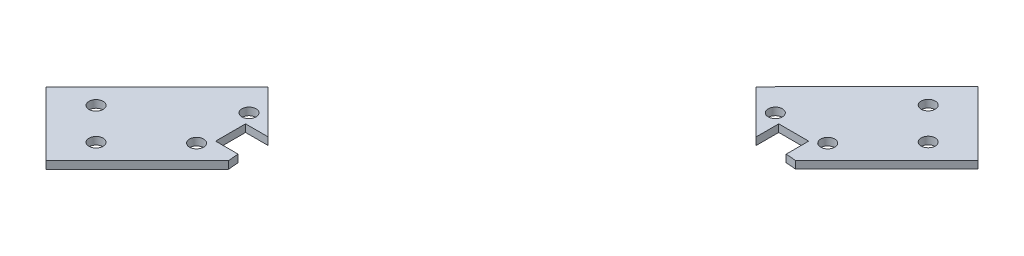
ISO-10303-21;
HEADER;
FILE_DESCRIPTION(('STEP AP214'),'2;1');
FILE_NAME('part.step','',(''),(''),'','','');
FILE_SCHEMA(('AUTOMOTIVE_DESIGN { 1 0 10303 214 1 1 1 1 }'));
ENDSEC;
DATA;
#1=APPLICATION_CONTEXT('core data for automotive mechanical design processes');
#2=APPLICATION_PROTOCOL_DEFINITION('international standard','automotive_design',2000,#1);
#3=PRODUCT_CONTEXT('',#1,'mechanical');
#4=PRODUCT('Part','Part','',(#3));
#5=PRODUCT_RELATED_PRODUCT_CATEGORY('part','',(#4));
#6=PRODUCT_DEFINITION_FORMATION('','',#4);
#7=PRODUCT_DEFINITION_CONTEXT('part definition',#1,'design');
#8=PRODUCT_DEFINITION('design','',#6,#7);
#9=PRODUCT_DEFINITION_SHAPE('','',#8);
#10=(LENGTH_UNIT() NAMED_UNIT(*) SI_UNIT(.MILLI.,.METRE.));
#11=(NAMED_UNIT(*) PLANE_ANGLE_UNIT() SI_UNIT($,.RADIAN.));
#12=(NAMED_UNIT(*) SI_UNIT($,.STERADIAN.) SOLID_ANGLE_UNIT());
#13=UNCERTAINTY_MEASURE_WITH_UNIT(LENGTH_MEASURE(1.E-05),#10,'distance_accuracy_value','');
#14=(GEOMETRIC_REPRESENTATION_CONTEXT(3) GLOBAL_UNCERTAINTY_ASSIGNED_CONTEXT((#13)) GLOBAL_UNIT_ASSIGNED_CONTEXT((#10,
#11,#12)) REPRESENTATION_CONTEXT('',''));
#15=CARTESIAN_POINT('',(0.,0.,0.));
#16=DIRECTION('',(0.,0.,1.));
#17=DIRECTION('',(1.,0.,0.));
#18=AXIS2_PLACEMENT_3D('',#15,#16,#17);
#19=CARTESIAN_POINT('',(0.,1.5875,0.));
#20=DIRECTION('',(0.,1.,0.));
#21=DIRECTION('',(0.,0.,1.));
#22=AXIS2_PLACEMENT_3D('',#19,#20,#21);
#23=PLANE('',#22);
#24=CARTESIAN_POINT('',(-72.1592637490422,1.5875,16.043664022809));
#25=DIRECTION('',(0.,1.,0.));
#26=DIRECTION('',(0.,0.,1.));
#27=AXIS2_PLACEMENT_3D('',#24,#25,#26);
#28=CIRCLE('',#27,1.5);
#29=CARTESIAN_POINT('',(-72.1592637490422,1.5875,17.543664022809));
#30=VERTEX_POINT('',#29);
#31=EDGE_CURVE('E194',#30,#30,#28,.T.);
#32=ORIENTED_EDGE('',*,*,#31,.F.);
#33=EDGE_LOOP('',(#32));
#34=FACE_BOUND('',#33,.T.);
#35=CARTESIAN_POINT('',(-78.9286379907904,1.5875,9.2807290260109));
#36=DIRECTION('',(0.,1.,0.));
#37=DIRECTION('',(0.,0.,1.));
#38=AXIS2_PLACEMENT_3D('',#35,#36,#37);
#39=CIRCLE('',#38,1.5);
#40=CARTESIAN_POINT('',(-78.9286379907904,1.5875,10.7807290260109));
#41=VERTEX_POINT('',#40);
#42=EDGE_CURVE('E230',#41,#41,#39,.T.);
#43=ORIENTED_EDGE('',*,*,#42,.F.);
#44=EDGE_LOOP('',(#43));
#45=FACE_BOUND('',#44,.T.);
#46=DIRECTION('',(0.706770229864482,0.,-0.707443172401365));
#47=VECTOR('',#46,1.);
#48=CARTESIAN_POINT('',(11.12169927642,1.5875,-87.6247258638486));
#49=LINE('',#48,#47);
#50=CARTESIAN_POINT('',(-87.6141018356481,1.5875,11.2050853206221));
#51=VERTEX_POINT('',#50);
#52=CARTESIAN_POINT('',(-64.0867150619098,1.5875,-12.3447027635743));
#53=VERTEX_POINT('',#52);
#54=EDGE_CURVE('E60',#51,#53,#49,.T.);
#55=ORIENTED_EDGE('',*,*,#54,.F.);
#56=DIRECTION('',(-0.707443172401365,0.,-0.706770229864482));
#57=VECTOR('',#56,1.);
#58=CARTESIAN_POINT('',(-49.3679005560341,1.5875,49.4149055922353));
#59=LINE('',#58,#57);
#60=CARTESIAN_POINT('',(-74.0753533521517,1.5875,24.7309553142183));
#61=VERTEX_POINT('',#60);
#62=EDGE_CURVE('E121',#61,#51,#59,.T.);
#63=ORIENTED_EDGE('',*,*,#62,.F.);
#64=DIRECTION('',(-0.706770229864482,0.,0.707443172401365));
#65=VECTOR('',#64,1.);
#66=CARTESIAN_POINT('',(-24.7074527961177,1.5875,-24.683950278017));
#67=LINE('',#66,#65);
#68=CARTESIAN_POINT('',(-54.7368246857531,1.5875,5.3740137068235));
#69=VERTEX_POINT('',#68);
#70=EDGE_CURVE('E170',#69,#61,#67,.T.);
#71=ORIENTED_EDGE('',*,*,#70,.F.);
#72=CARTESIAN_POINT('',(0.,1.5875,0.));
#73=DIRECTION('',(0.,1.,0.));
#74=DIRECTION('',(0.,0.,1.));
#75=AXIS2_PLACEMENT_3D('',#72,#73,#74);
#76=CIRCLE('',#75,55.);
#77=CARTESIAN_POINT('',(-54.9082814792085,1.5875,3.17500000000139));
#78=VERTEX_POINT('',#77);
#79=EDGE_CURVE('E143',#78,#69,#76,.T.);
#80=ORIENTED_EDGE('',*,*,#79,.F.);
#81=DIRECTION('',(1.,0.,0.));
#82=VECTOR('',#81,1.);
#83=CARTESIAN_POINT('',(-53.3400000000002,1.5875,3.17500000000139));
#84=LINE('',#83,#82);
#85=CARTESIAN_POINT('',(-59.6900000000002,1.5875,3.1750000000014));
#86=VERTEX_POINT('',#85);
#87=EDGE_CURVE('E157',#86,#78,#84,.T.);
#88=ORIENTED_EDGE('',*,*,#87,.F.);
#89=DIRECTION('',(0.,0.,1.));
#90=VECTOR('',#89,1.);
#91=CARTESIAN_POINT('',(-59.6900000000002,1.5875,-3.1749999999986));
#92=LINE('',#91,#90);
#93=CARTESIAN_POINT('',(-59.6900000000002,1.5875,-3.1749999999986));
#94=VERTEX_POINT('',#93);
#95=EDGE_CURVE('E155',#94,#86,#92,.T.);
#96=ORIENTED_EDGE('',*,*,#95,.F.);
#97=DIRECTION('',(-1.,0.,0.));
#98=VECTOR('',#97,1.);
#99=CARTESIAN_POINT('',(-53.3400000000002,1.5875,-3.17499999999861));
#100=LINE('',#99,#98);
#101=CARTESIAN_POINT('',(-54.9082814792087,1.5875,-3.17499999999861));
#102=VERTEX_POINT('',#101);
#103=EDGE_CURVE('E151',#102,#94,#100,.T.);
#104=ORIENTED_EDGE('',*,*,#103,.F.);
#105=DIRECTION('',(0.707443172401365,0.,0.706770229864482));
#106=VECTOR('',#105,1.);
#107=CARTESIAN_POINT('',(-54.9082814792087,1.5875,-3.17499999999861));
#108=LINE('',#107,#106);
#109=EDGE_CURVE('E53',#53,#102,#108,.T.);
#110=ORIENTED_EDGE('',*,*,#109,.F.);
#111=EDGE_LOOP('',(#55,#63,#71,#80,#88,#96,#104,#110));
#112=FACE_BOUND('',#111,.T.);
#113=CARTESIAN_POINT('',(-61.346730494,1.5875,-5.55625));
#114=DIRECTION('',(0.,1.,0.));
#115=DIRECTION('',(0.,0.,1.));
#116=AXIS2_PLACEMENT_3D('',#113,#114,#115);
#117=CIRCLE('',#116,1.5);
#118=CARTESIAN_POINT('',(-61.346730494,1.5875,-4.05625));
#119=VERTEX_POINT('',#118);
#120=EDGE_CURVE('E137',#119,#119,#117,.T.);
#121=ORIENTED_EDGE('',*,*,#120,.F.);
#122=EDGE_LOOP('',(#121));
#123=FACE_BOUND('',#122,.T.);
#124=CARTESIAN_POINT('',(-61.346730494,1.5875,5.55625));
#125=DIRECTION('',(0.,1.,0.));
#126=DIRECTION('',(0.,0.,1.));
#127=AXIS2_PLACEMENT_3D('',#124,#125,#126);
#128=CIRCLE('',#127,1.5);
#129=CARTESIAN_POINT('',(-61.346730494,1.5875,7.05625));
#130=VERTEX_POINT('',#129);
#131=EDGE_CURVE('E140',#130,#130,#128,.T.);
#132=ORIENTED_EDGE('',*,*,#131,.F.);
#133=EDGE_LOOP('',(#132));
#134=FACE_BOUND('',#133,.T.);
#135=ADVANCED_FACE('F46',(#34,#45,#112,#123,#134),#23,.T.);
#136=CARTESIAN_POINT('',(0.,0.,0.));
#137=DIRECTION('',(0.,1.,0.));
#138=DIRECTION('',(0.,0.,1.));
#139=AXIS2_PLACEMENT_3D('',#136,#137,#138);
#140=PLANE('',#139);
#141=CARTESIAN_POINT('',(-72.1592637490422,0.,16.043664022809));
#142=DIRECTION('',(0.,1.,0.));
#143=DIRECTION('',(0.,0.,1.));
#144=AXIS2_PLACEMENT_3D('',#141,#142,#143);
#145=CIRCLE('',#144,1.5);
#146=CARTESIAN_POINT('',(-72.1592637490422,0.,17.543664022809));
#147=VERTEX_POINT('',#146);
#148=EDGE_CURVE('E191',#147,#147,#145,.T.);
#149=ORIENTED_EDGE('',*,*,#148,.T.);
#150=EDGE_LOOP('',(#149));
#151=FACE_BOUND('',#150,.T.);
#152=CARTESIAN_POINT('',(-78.9286379907904,0.,9.2807290260109));
#153=DIRECTION('',(0.,1.,0.));
#154=DIRECTION('',(0.,0.,1.));
#155=AXIS2_PLACEMENT_3D('',#152,#153,#154);
#156=CIRCLE('',#155,1.5);
#157=CARTESIAN_POINT('',(-78.9286379907904,0.,10.7807290260109));
#158=VERTEX_POINT('',#157);
#159=EDGE_CURVE('E232',#158,#158,#156,.T.);
#160=ORIENTED_EDGE('',*,*,#159,.T.);
#161=EDGE_LOOP('',(#160));
#162=FACE_BOUND('',#161,.T.);
#163=CARTESIAN_POINT('',(-61.346730494,0.,-5.55625));
#164=DIRECTION('',(0.,1.,0.));
#165=DIRECTION('',(0.,0.,1.));
#166=AXIS2_PLACEMENT_3D('',#163,#164,#165);
#167=CIRCLE('',#166,1.5);
#168=CARTESIAN_POINT('',(-61.346730494,0.,-4.05625));
#169=VERTEX_POINT('',#168);
#170=EDGE_CURVE('E122',#169,#169,#167,.T.);
#171=ORIENTED_EDGE('',*,*,#170,.T.);
#172=EDGE_LOOP('',(#171));
#173=FACE_BOUND('',#172,.T.);
#174=CARTESIAN_POINT('',(-61.346730494,0.,5.55625));
#175=DIRECTION('',(0.,1.,0.));
#176=DIRECTION('',(0.,0.,1.));
#177=AXIS2_PLACEMENT_3D('',#174,#175,#176);
#178=CIRCLE('',#177,1.5);
#179=CARTESIAN_POINT('',(-61.346730494,0.,7.05625));
#180=VERTEX_POINT('',#179);
#181=EDGE_CURVE('E135',#180,#180,#178,.T.);
#182=ORIENTED_EDGE('',*,*,#181,.T.);
#183=EDGE_LOOP('',(#182));
#184=FACE_BOUND('',#183,.T.);
#185=DIRECTION('',(-0.707443172401365,0.,-0.706770229864482));
#186=VECTOR('',#185,1.);
#187=CARTESIAN_POINT('',(-49.3679005560341,0.,49.4149055922353));
#188=LINE('',#187,#186);
#189=CARTESIAN_POINT('',(-74.0753533521517,0.,24.7309553142183));
#190=VERTEX_POINT('',#189);
#191=CARTESIAN_POINT('',(-87.6141018356481,0.,11.2050853206221));
#192=VERTEX_POINT('',#191);
#193=EDGE_CURVE('E119',#190,#192,#188,.T.);
#194=ORIENTED_EDGE('',*,*,#193,.T.);
#195=DIRECTION('',(0.706770229864482,0.,-0.707443172401365));
#196=VECTOR('',#195,1.);
#197=CARTESIAN_POINT('',(11.12169927642,0.,-87.6247258638486));
#198=LINE('',#197,#196);
#199=CARTESIAN_POINT('',(-64.0867150619098,0.,-12.3447027635743));
#200=VERTEX_POINT('',#199);
#201=EDGE_CURVE('E108',#192,#200,#198,.T.);
#202=ORIENTED_EDGE('',*,*,#201,.T.);
#203=DIRECTION('',(0.707443172401365,0.,0.706770229864482));
#204=VECTOR('',#203,1.);
#205=CARTESIAN_POINT('',(-54.9082814792087,0.,-3.17499999999861));
#206=LINE('',#205,#204);
#207=CARTESIAN_POINT('',(-54.9082814792087,0.,-3.17499999999861));
#208=VERTEX_POINT('',#207);
#209=EDGE_CURVE('E67',#200,#208,#206,.T.);
#210=ORIENTED_EDGE('',*,*,#209,.T.);
#211=DIRECTION('',(-1.,0.,0.));
#212=VECTOR('',#211,1.);
#213=CARTESIAN_POINT('',(0.,0.,-3.17499999999861));
#214=LINE('',#213,#212);
#215=CARTESIAN_POINT('',(-59.6900000000002,0.,-3.1749999999986));
#216=VERTEX_POINT('',#215);
#217=EDGE_CURVE('E169',#208,#216,#214,.T.);
#218=ORIENTED_EDGE('',*,*,#217,.T.);
#219=DIRECTION('',(0.,0.,1.));
#220=VECTOR('',#219,1.);
#221=CARTESIAN_POINT('',(-59.6900000000002,0.,-3.1749999999986));
#222=LINE('',#221,#220);
#223=CARTESIAN_POINT('',(-59.6900000000002,0.,3.1750000000014));
#224=VERTEX_POINT('',#223);
#225=EDGE_CURVE('E166',#216,#224,#222,.T.);
#226=ORIENTED_EDGE('',*,*,#225,.T.);
#227=DIRECTION('',(1.,0.,0.));
#228=VECTOR('',#227,1.);
#229=CARTESIAN_POINT('',(-59.6900000000002,0.,3.1750000000014));
#230=LINE('',#229,#228);
#231=CARTESIAN_POINT('',(-54.9082814792085,0.,3.17500000000139));
#232=VERTEX_POINT('',#231);
#233=EDGE_CURVE('E163',#224,#232,#230,.T.);
#234=ORIENTED_EDGE('',*,*,#233,.T.);
#235=CARTESIAN_POINT('',(0.,0.,0.));
#236=DIRECTION('',(0.,1.,0.));
#237=DIRECTION('',(0.,0.,1.));
#238=AXIS2_PLACEMENT_3D('',#235,#236,#237);
#239=CIRCLE('',#238,55.);
#240=CARTESIAN_POINT('',(-54.7368246857531,0.,5.3740137068235));
#241=VERTEX_POINT('',#240);
#242=EDGE_CURVE('E131',#232,#241,#239,.T.);
#243=ORIENTED_EDGE('',*,*,#242,.T.);
#244=DIRECTION('',(-0.706770229864482,0.,0.707443172401365));
#245=VECTOR('',#244,1.);
#246=CARTESIAN_POINT('',(-24.7074527961177,0.,-24.683950278017));
#247=LINE('',#246,#245);
#248=EDGE_CURVE('E127',#241,#190,#247,.T.);
#249=ORIENTED_EDGE('',*,*,#248,.T.);
#250=EDGE_LOOP('',(#194,#202,#210,#218,#226,#234,#243,#249));
#251=FACE_BOUND('',#250,.T.);
#252=ADVANCED_FACE('F125',(#151,#162,#173,#184,#251),#140,.F.);
#253=CARTESIAN_POINT('',(-49.3679005560341,1.5875,49.4149055922353));
#254=DIRECTION('',(-0.706770229864482,0.,0.707443172401365));
#255=DIRECTION('',(0.707443172401365,0.,0.706770229864482));
#256=AXIS2_PLACEMENT_3D('',#253,#254,#255);
#257=PLANE('',#256);
#258=DIRECTION('',(0.,1.,0.));
#259=VECTOR('',#258,1.);
#260=CARTESIAN_POINT('',(-87.6141018356481,0.,11.2050853206221));
#261=LINE('',#260,#259);
#262=EDGE_CURVE('E111',#192,#51,#261,.T.);
#263=ORIENTED_EDGE('',*,*,#262,.F.);
#264=ORIENTED_EDGE('',*,*,#193,.F.);
#265=DIRECTION('',(0.,1.,0.));
#266=VECTOR('',#265,1.);
#267=CARTESIAN_POINT('',(-74.0753533521517,-8.4125,24.7309553142183));
#268=LINE('',#267,#266);
#269=EDGE_CURVE('E128',#190,#61,#268,.T.);
#270=ORIENTED_EDGE('',*,*,#269,.T.);
#271=ORIENTED_EDGE('',*,*,#62,.T.);
#272=EDGE_LOOP('',(#263,#264,#270,#271));
#273=FACE_BOUND('',#272,.T.);
#274=ADVANCED_FACE('F117',(#273),#257,.T.);
#275=CARTESIAN_POINT('',(-61.346730494,1.5875,-5.55625));
#276=DIRECTION('',(0.,-1.,0.));
#277=DIRECTION('',(0.,0.,-1.));
#278=AXIS2_PLACEMENT_3D('',#275,#276,#277);
#279=CYLINDRICAL_SURFACE('',#278,1.5);
#280=ORIENTED_EDGE('',*,*,#120,.T.);
#281=EDGE_LOOP('',(#280));
#282=FACE_BOUND('',#281,.T.);
#283=ORIENTED_EDGE('',*,*,#170,.F.);
#284=EDGE_LOOP('',(#283));
#285=FACE_BOUND('',#284,.T.);
#286=ADVANCED_FACE('F207',(#282,#285),#279,.F.);
#287=CARTESIAN_POINT('',(-61.346730494,1.5875,5.55625));
#288=DIRECTION('',(0.,-1.,0.));
#289=DIRECTION('',(0.,0.,-1.));
#290=AXIS2_PLACEMENT_3D('',#287,#288,#289);
#291=CYLINDRICAL_SURFACE('',#290,1.5);
#292=ORIENTED_EDGE('',*,*,#131,.T.);
#293=EDGE_LOOP('',(#292));
#294=FACE_BOUND('',#293,.T.);
#295=ORIENTED_EDGE('',*,*,#181,.F.);
#296=EDGE_LOOP('',(#295));
#297=FACE_BOUND('',#296,.T.);
#298=ADVANCED_FACE('F205',(#294,#297),#291,.F.);
#299=CARTESIAN_POINT('',(0.,1.5875,0.));
#300=DIRECTION('',(0.,-1.,0.));
#301=DIRECTION('',(0.,0.,-1.));
#302=AXIS2_PLACEMENT_3D('',#299,#300,#301);
#303=CYLINDRICAL_SURFACE('',#302,55.);
#304=DIRECTION('',(0.,1.,0.));
#305=VECTOR('',#304,1.);
#306=CARTESIAN_POINT('',(-54.7368246857531,-8.4125,5.3740137068235));
#307=LINE('',#306,#305);
#308=EDGE_CURVE('E162',#241,#69,#307,.T.);
#309=ORIENTED_EDGE('',*,*,#308,.F.);
#310=ORIENTED_EDGE('',*,*,#242,.F.);
#311=DIRECTION('',(0.,-1.,0.));
#312=VECTOR('',#311,1.);
#313=CARTESIAN_POINT('',(-54.9082814792085,1.5875,3.17500000000139));
#314=LINE('',#313,#312);
#315=EDGE_CURVE('E145',#78,#232,#314,.T.);
#316=ORIENTED_EDGE('',*,*,#315,.F.);
#317=ORIENTED_EDGE('',*,*,#79,.T.);
#318=EDGE_LOOP('',(#309,#310,#316,#317));
#319=FACE_BOUND('',#318,.T.);
#320=ADVANCED_FACE('F181',(#319),#303,.F.);
#321=CARTESIAN_POINT('',(-53.3400000000002,0.,3.17500000000139));
#322=DIRECTION('',(0.,0.,1.));
#323=DIRECTION('',(1.,0.,0.));
#324=AXIS2_PLACEMENT_3D('',#321,#322,#323);
#325=PLANE('',#324);
#326=ORIENTED_EDGE('',*,*,#315,.T.);
#327=ORIENTED_EDGE('',*,*,#233,.F.);
#328=DIRECTION('',(0.,1.,0.));
#329=VECTOR('',#328,1.);
#330=CARTESIAN_POINT('',(-59.6900000000002,0.,3.1750000000014));
#331=LINE('',#330,#329);
#332=EDGE_CURVE('E147',#224,#86,#331,.T.);
#333=ORIENTED_EDGE('',*,*,#332,.T.);
#334=ORIENTED_EDGE('',*,*,#87,.T.);
#335=EDGE_LOOP('',(#326,#327,#333,#334));
#336=FACE_BOUND('',#335,.T.);
#337=ADVANCED_FACE('F214',(#336),#325,.F.);
#338=CARTESIAN_POINT('',(-59.6900000000002,0.,-3.1749999999986));
#339=DIRECTION('',(-1.,0.,0.));
#340=DIRECTION('',(0.,0.,1.));
#341=AXIS2_PLACEMENT_3D('',#338,#339,#340);
#342=PLANE('',#341);
#343=ORIENTED_EDGE('',*,*,#95,.T.);
#344=ORIENTED_EDGE('',*,*,#332,.F.);
#345=ORIENTED_EDGE('',*,*,#225,.F.);
#346=DIRECTION('',(0.,1.,0.));
#347=VECTOR('',#346,1.);
#348=CARTESIAN_POINT('',(-59.6900000000002,0.,-3.1749999999986));
#349=LINE('',#348,#347);
#350=EDGE_CURVE('E152',#216,#94,#349,.T.);
#351=ORIENTED_EDGE('',*,*,#350,.T.);
#352=EDGE_LOOP('',(#343,#344,#345,#351));
#353=FACE_BOUND('',#352,.T.);
#354=ADVANCED_FACE('F281',(#353),#342,.F.);
#355=CARTESIAN_POINT('',(-53.3400000000002,0.,-3.17499999999861));
#356=DIRECTION('',(0.,0.,-1.));
#357=DIRECTION('',(-1.,0.,0.));
#358=AXIS2_PLACEMENT_3D('',#355,#356,#357);
#359=PLANE('',#358);
#360=DIRECTION('',(0.,-1.,0.));
#361=VECTOR('',#360,1.);
#362=CARTESIAN_POINT('',(-54.9082814792087,1.5875,-3.17499999999861));
#363=LINE('',#362,#361);
#364=EDGE_CURVE('E148',#208,#102,#363,.F.);
#365=ORIENTED_EDGE('',*,*,#364,.T.);
#366=ORIENTED_EDGE('',*,*,#103,.T.);
#367=ORIENTED_EDGE('',*,*,#350,.F.);
#368=ORIENTED_EDGE('',*,*,#217,.F.);
#369=EDGE_LOOP('',(#365,#366,#367,#368));
#370=FACE_BOUND('',#369,.T.);
#371=ADVANCED_FACE('F292',(#370),#359,.F.);
#372=CARTESIAN_POINT('',(-24.7074527961177,-8.4125,-24.683950278017));
#373=DIRECTION('',(-0.707443172401365,0.,-0.706770229864482));
#374=DIRECTION('',(-0.706770229864482,0.,0.707443172401365));
#375=AXIS2_PLACEMENT_3D('',#372,#373,#374);
#376=PLANE('',#375);
#377=ORIENTED_EDGE('',*,*,#308,.T.);
#378=ORIENTED_EDGE('',*,*,#70,.T.);
#379=ORIENTED_EDGE('',*,*,#269,.F.);
#380=ORIENTED_EDGE('',*,*,#248,.F.);
#381=EDGE_LOOP('',(#377,#378,#379,#380));
#382=FACE_BOUND('',#381,.T.);
#383=ADVANCED_FACE('F185',(#382),#376,.F.);
#384=CARTESIAN_POINT('',(-54.9082814792087,0.,-3.17499999999861));
#385=DIRECTION('',(-0.706770229864482,0.,0.707443172401365));
#386=DIRECTION('',(0.707443172401365,0.,0.706770229864482));
#387=AXIS2_PLACEMENT_3D('',#384,#385,#386);
#388=PLANE('',#387);
#389=ORIENTED_EDGE('',*,*,#209,.F.);
#390=DIRECTION('',(0.,1.,0.));
#391=VECTOR('',#390,1.);
#392=CARTESIAN_POINT('',(-64.0867150619098,0.,-12.3447027635743));
#393=LINE('',#392,#391);
#394=EDGE_CURVE('E12',#200,#53,#393,.T.);
#395=ORIENTED_EDGE('',*,*,#394,.T.);
#396=ORIENTED_EDGE('',*,*,#109,.T.);
#397=ORIENTED_EDGE('',*,*,#364,.F.);
#398=EDGE_LOOP('',(#389,#395,#396,#397));
#399=FACE_BOUND('',#398,.T.);
#400=ADVANCED_FACE('F250',(#399),#388,.F.);
#401=CARTESIAN_POINT('',(11.12169927642,0.,-87.6247258638486));
#402=DIRECTION('',(0.707443172401365,0.,0.706770229864482));
#403=DIRECTION('',(0.706770229864482,0.,-0.707443172401365));
#404=AXIS2_PLACEMENT_3D('',#401,#402,#403);
#405=PLANE('',#404);
#406=ORIENTED_EDGE('',*,*,#201,.F.);
#407=ORIENTED_EDGE('',*,*,#262,.T.);
#408=ORIENTED_EDGE('',*,*,#54,.T.);
#409=ORIENTED_EDGE('',*,*,#394,.F.);
#410=EDGE_LOOP('',(#406,#407,#408,#409));
#411=FACE_BOUND('',#410,.T.);
#412=ADVANCED_FACE('F110',(#411),#405,.F.);
#413=CARTESIAN_POINT('',(-78.9286379907904,0.,9.2807290260109));
#414=DIRECTION('',(0.,1.,0.));
#415=DIRECTION('',(0.,0.,1.));
#416=AXIS2_PLACEMENT_3D('',#413,#414,#415);
#417=CYLINDRICAL_SURFACE('',#416,1.5);
#418=ORIENTED_EDGE('',*,*,#159,.F.);
#419=EDGE_LOOP('',(#418));
#420=FACE_BOUND('',#419,.T.);
#421=ORIENTED_EDGE('',*,*,#42,.T.);
#422=EDGE_LOOP('',(#421));
#423=FACE_BOUND('',#422,.T.);
#424=ADVANCED_FACE('F239',(#420,#423),#417,.F.);
#425=CARTESIAN_POINT('',(-72.1592637490422,0.,16.043664022809));
#426=DIRECTION('',(0.,1.,0.));
#427=DIRECTION('',(0.,0.,1.));
#428=AXIS2_PLACEMENT_3D('',#425,#426,#427);
#429=CYLINDRICAL_SURFACE('',#428,1.5);
#430=ORIENTED_EDGE('',*,*,#148,.F.);
#431=EDGE_LOOP('',(#430));
#432=FACE_BOUND('',#431,.T.);
#433=ORIENTED_EDGE('',*,*,#31,.T.);
#434=EDGE_LOOP('',(#433));
#435=FACE_BOUND('',#434,.T.);
#436=ADVANCED_FACE('F237',(#432,#435),#429,.F.);
#437=CLOSED_SHELL('',(#135,#252,#274,#286,#298,#320,#337,#354,#371,#383,#400,#412,#424,#436));
#438=MANIFOLD_SOLID_BREP('B2',#437);
#439=CARTESIAN_POINT('',(5.55625,1.5875,-61.346730494));
#440=DIRECTION('',(0.,-1.,0.));
#441=DIRECTION('',(0.,0.,-1.));
#442=AXIS2_PLACEMENT_3D('',#439,#440,#441);
#443=CYLINDRICAL_SURFACE('',#442,1.5);
#444=CARTESIAN_POINT('',(5.55625,1.5875,-61.346730494));
#445=DIRECTION('',(0.,1.,0.));
#446=DIRECTION('',(0.,0.,1.));
#447=AXIS2_PLACEMENT_3D('',#444,#445,#446);
#448=CIRCLE('',#447,1.5);
#449=CARTESIAN_POINT('',(5.55625,1.5875,-59.846730494));
#450=VERTEX_POINT('',#449);
#451=EDGE_CURVE('E502',#450,#450,#448,.T.);
#452=ORIENTED_EDGE('',*,*,#451,.T.);
#453=EDGE_LOOP('',(#452));
#454=FACE_BOUND('',#453,.T.);
#455=CARTESIAN_POINT('',(5.55625,0.,-61.346730494));
#456=DIRECTION('',(0.,1.,0.));
#457=DIRECTION('',(0.,0.,1.));
#458=AXIS2_PLACEMENT_3D('',#455,#456,#457);
#459=CIRCLE('',#458,1.5);
#460=CARTESIAN_POINT('',(5.55625,0.,-59.846730494));
#461=VERTEX_POINT('',#460);
#462=EDGE_CURVE('E468',#461,#461,#459,.T.);
#463=ORIENTED_EDGE('',*,*,#462,.F.);
#464=EDGE_LOOP('',(#463));
#465=FACE_BOUND('',#464,.T.);
#466=ADVANCED_FACE('F381',(#454,#465),#443,.F.);
#467=CARTESIAN_POINT('',(-5.55625,1.5875,-61.346730494));
#468=DIRECTION('',(0.,-1.,0.));
#469=DIRECTION('',(0.,0.,-1.));
#470=AXIS2_PLACEMENT_3D('',#467,#468,#469);
#471=CYLINDRICAL_SURFACE('',#470,1.5);
#472=CARTESIAN_POINT('',(-5.55625,1.5875,-61.346730494));
#473=DIRECTION('',(0.,1.,0.));
#474=DIRECTION('',(0.,0.,1.));
#475=AXIS2_PLACEMENT_3D('',#472,#473,#474);
#476=CIRCLE('',#475,1.5);
#477=CARTESIAN_POINT('',(-5.55625,1.5875,-59.846730494));
#478=VERTEX_POINT('',#477);
#479=EDGE_CURVE('E500',#478,#478,#476,.T.);
#480=ORIENTED_EDGE('',*,*,#479,.T.);
#481=EDGE_LOOP('',(#480));
#482=FACE_BOUND('',#481,.T.);
#483=CARTESIAN_POINT('',(-5.55625,0.,-61.346730494));
#484=DIRECTION('',(0.,1.,0.));
#485=DIRECTION('',(0.,0.,1.));
#486=AXIS2_PLACEMENT_3D('',#483,#484,#485);
#487=CIRCLE('',#486,1.5);
#488=CARTESIAN_POINT('',(-5.55625,0.,-59.846730494));
#489=VERTEX_POINT('',#488);
#490=EDGE_CURVE('E464',#489,#489,#487,.T.);
#491=ORIENTED_EDGE('',*,*,#490,.F.);
#492=EDGE_LOOP('',(#491));
#493=FACE_BOUND('',#492,.T.);
#494=ADVANCED_FACE('F526',(#482,#493),#471,.F.);
#495=CARTESIAN_POINT('',(3.175,0.,-53.34));
#496=DIRECTION('',(1.,0.,0.));
#497=DIRECTION('',(0.,0.,-1.));
#498=AXIS2_PLACEMENT_3D('',#495,#496,#497);
#499=PLANE('',#498);
#500=DIRECTION('',(0.,-1.,0.));
#501=VECTOR('',#500,1.);
#502=CARTESIAN_POINT('',(3.175,1.5875,-54.9082814792086));
#503=LINE('',#502,#501);
#504=CARTESIAN_POINT('',(3.175,0.,-54.9082814792086));
#505=VERTEX_POINT('',#504);
#506=CARTESIAN_POINT('',(3.175,1.5875,-54.9082814792086));
#507=VERTEX_POINT('',#506);
#508=EDGE_CURVE('E471',#505,#507,#503,.F.);
#509=ORIENTED_EDGE('',*,*,#508,.T.);
#510=DIRECTION('',(0.,0.,-1.));
#511=VECTOR('',#510,1.);
#512=CARTESIAN_POINT('',(3.175,1.5875,-53.34));
#513=LINE('',#512,#511);
#514=CARTESIAN_POINT('',(3.175,1.5875,-59.69));
#515=VERTEX_POINT('',#514);
#516=EDGE_CURVE('E584',#507,#515,#513,.T.);
#517=ORIENTED_EDGE('',*,*,#516,.T.);
#518=DIRECTION('',(0.,1.,0.));
#519=VECTOR('',#518,1.);
#520=CARTESIAN_POINT('',(3.175,0.,-59.69));
#521=LINE('',#520,#519);
#522=CARTESIAN_POINT('',(3.175,0.,-59.69));
#523=VERTEX_POINT('',#522);
#524=EDGE_CURVE('E495',#523,#515,#521,.T.);
#525=ORIENTED_EDGE('',*,*,#524,.F.);
#526=DIRECTION('',(0.,0.,-1.));
#527=VECTOR('',#526,1.);
#528=CARTESIAN_POINT('',(3.175,0.,0.));
#529=LINE('',#528,#527);
#530=EDGE_CURVE('E482',#505,#523,#529,.T.);
#531=ORIENTED_EDGE('',*,*,#530,.F.);
#532=EDGE_LOOP('',(#509,#517,#525,#531));
#533=FACE_BOUND('',#532,.T.);
#534=ADVANCED_FACE('F531',(#533),#499,.F.);
#535=CARTESIAN_POINT('',(0.,1.5875,0.));
#536=DIRECTION('',(0.,-1.,0.));
#537=DIRECTION('',(0.,0.,-1.));
#538=AXIS2_PLACEMENT_3D('',#535,#536,#537);
#539=CYLINDRICAL_SURFACE('',#538,55.);
#540=DIRECTION('',(0.,1.,0.));
#541=VECTOR('',#540,1.);
#542=CARTESIAN_POINT('',(5.32191909351782,-8.4125,-54.7419142628576));
#543=LINE('',#542,#541);
#544=CARTESIAN_POINT('',(5.32191909351782,0.,-54.7419142628576));
#545=VERTEX_POINT('',#544);
#546=CARTESIAN_POINT('',(5.32191909351782,1.5875,-54.7419142628576));
#547=VERTEX_POINT('',#546);
#548=EDGE_CURVE('E403',#545,#547,#543,.T.);
#549=ORIENTED_EDGE('',*,*,#548,.T.);
#550=CARTESIAN_POINT('',(0.,1.5875,0.));
#551=DIRECTION('',(0.,1.,0.));
#552=DIRECTION('',(0.,0.,1.));
#553=AXIS2_PLACEMENT_3D('',#550,#551,#552);
#554=CIRCLE('',#553,55.);
#555=EDGE_CURVE('E474',#547,#507,#554,.T.);
#556=ORIENTED_EDGE('',*,*,#555,.T.);
#557=ORIENTED_EDGE('',*,*,#508,.F.);
#558=CARTESIAN_POINT('',(0.,0.,0.));
#559=DIRECTION('',(0.,1.,0.));
#560=DIRECTION('',(0.,0.,1.));
#561=AXIS2_PLACEMENT_3D('',#558,#559,#560);
#562=CIRCLE('',#561,55.);
#563=EDGE_CURVE('E479',#545,#505,#562,.T.);
#564=ORIENTED_EDGE('',*,*,#563,.F.);
#565=EDGE_LOOP('',(#549,#556,#557,#564));
#566=FACE_BOUND('',#565,.T.);
#567=ADVANCED_FACE('F488',(#566),#539,.F.);
#568=CARTESIAN_POINT('',(-24.7074527961177,-8.4125,-24.683950278017));
#569=DIRECTION('',(-0.707443172401365,0.,-0.706770229864482));
#570=DIRECTION('',(-0.706770229864482,0.,0.707443172401365));
#571=AXIS2_PLACEMENT_3D('',#568,#569,#570);
#572=PLANE('',#571);
#573=DIRECTION('',(0.,1.,0.));
#574=VECTOR('',#573,1.);
#575=CARTESIAN_POINT('',(24.6604477599164,-8.4125,-74.0988558702524));
#576=LINE('',#575,#574);
#577=CARTESIAN_POINT('',(24.6604477599164,0.,-74.0988558702524));
#578=VERTEX_POINT('',#577);
#579=CARTESIAN_POINT('',(24.6604477599164,1.5875,-74.0988558702524));
#580=VERTEX_POINT('',#579);
#581=EDGE_CURVE('E463',#578,#580,#576,.T.);
#582=ORIENTED_EDGE('',*,*,#581,.T.);
#583=DIRECTION('',(-0.706770229864482,0.,0.707443172401365));
#584=VECTOR('',#583,1.);
#585=CARTESIAN_POINT('',(-24.7074527961177,1.5875,-24.683950278017));
#586=LINE('',#585,#584);
#587=EDGE_CURVE('E579',#580,#547,#586,.T.);
#588=ORIENTED_EDGE('',*,*,#587,.T.);
#589=ORIENTED_EDGE('',*,*,#548,.F.);
#590=DIRECTION('',(-0.706770229864482,0.,0.707443172401365));
#591=VECTOR('',#590,1.);
#592=CARTESIAN_POINT('',(-24.7074527961177,0.,-24.683950278017));
#593=LINE('',#592,#591);
#594=EDGE_CURVE('E389',#578,#545,#593,.T.);
#595=ORIENTED_EDGE('',*,*,#594,.F.);
#596=EDGE_LOOP('',(#582,#588,#589,#595));
#597=FACE_BOUND('',#596,.T.);
#598=ADVANCED_FACE('F535',(#597),#572,.F.);
#599=CARTESIAN_POINT('',(49.3679005560341,1.5875,-49.4149055922353));
#600=DIRECTION('',(-0.706770229864482,0.,0.707443172401365));
#601=DIRECTION('',(0.707443172401365,0.,0.706770229864482));
#602=AXIS2_PLACEMENT_3D('',#599,#600,#601);
#603=PLANE('',#602);
#604=DIRECTION('',(-0.707443172401365,0.,-0.706770229864482));
#605=VECTOR('',#604,1.);
#606=CARTESIAN_POINT('',(49.3679005560341,0.,-49.4149055922353));
#607=LINE('',#606,#605);
#608=CARTESIAN_POINT('',(11.12169927642,0.,-87.6247258638486));
#609=VERTEX_POINT('',#608);
#610=EDGE_CURVE('E458',#578,#609,#607,.T.);
#611=ORIENTED_EDGE('',*,*,#610,.T.);
#612=DIRECTION('',(0.,1.,0.));
#613=VECTOR('',#612,1.);
#614=CARTESIAN_POINT('',(11.12169927642,0.,-87.6247258638486));
#615=LINE('',#614,#613);
#616=CARTESIAN_POINT('',(11.12169927642,1.5875,-87.6247258638486));
#617=VERTEX_POINT('',#616);
#618=EDGE_CURVE('E443',#609,#617,#615,.T.);
#619=ORIENTED_EDGE('',*,*,#618,.T.);
#620=DIRECTION('',(-0.707443172401365,0.,-0.706770229864482));
#621=VECTOR('',#620,1.);
#622=CARTESIAN_POINT('',(49.3679005560341,1.5875,-49.4149055922353));
#623=LINE('',#622,#621);
#624=EDGE_CURVE('E481',#580,#617,#623,.T.);
#625=ORIENTED_EDGE('',*,*,#624,.F.);
#626=ORIENTED_EDGE('',*,*,#581,.F.);
#627=EDGE_LOOP('',(#611,#619,#625,#626));
#628=FACE_BOUND('',#627,.T.);
#629=ADVANCED_FACE('F383',(#628),#603,.F.);
#630=CARTESIAN_POINT('',(3.175,0.,-59.69));
#631=DIRECTION('',(0.,0.,-1.));
#632=DIRECTION('',(-1.,0.,0.));
#633=AXIS2_PLACEMENT_3D('',#630,#631,#632);
#634=PLANE('',#633);
#635=DIRECTION('',(-1.,0.,0.));
#636=VECTOR('',#635,1.);
#637=CARTESIAN_POINT('',(3.175,1.5875,-59.69));
#638=LINE('',#637,#636);
#639=CARTESIAN_POINT('',(-3.175,1.5875,-59.69));
#640=VERTEX_POINT('',#639);
#641=EDGE_CURVE('E593',#515,#640,#638,.T.);
#642=ORIENTED_EDGE('',*,*,#641,.T.);
#643=DIRECTION('',(0.,1.,0.));
#644=VECTOR('',#643,1.);
#645=CARTESIAN_POINT('',(-3.175,0.,-59.69));
#646=LINE('',#645,#644);
#647=CARTESIAN_POINT('',(-3.175,0.,-59.69));
#648=VERTEX_POINT('',#647);
#649=EDGE_CURVE('E493',#648,#640,#646,.T.);
#650=ORIENTED_EDGE('',*,*,#649,.F.);
#651=DIRECTION('',(-1.,0.,0.));
#652=VECTOR('',#651,1.);
#653=CARTESIAN_POINT('',(3.175,0.,-59.69));
#654=LINE('',#653,#652);
#655=EDGE_CURVE('E586',#523,#648,#654,.T.);
#656=ORIENTED_EDGE('',*,*,#655,.F.);
#657=ORIENTED_EDGE('',*,*,#524,.T.);
#658=EDGE_LOOP('',(#642,#650,#656,#657));
#659=FACE_BOUND('',#658,.T.);
#660=ADVANCED_FACE('F544',(#659),#634,.F.);
#661=CARTESIAN_POINT('',(-3.175,0.,-53.34));
#662=DIRECTION('',(-1.,0.,0.));
#663=DIRECTION('',(0.,0.,1.));
#664=AXIS2_PLACEMENT_3D('',#661,#662,#663);
#665=PLANE('',#664);
#666=DIRECTION('',(0.,-1.,0.));
#667=VECTOR('',#666,1.);
#668=CARTESIAN_POINT('',(-3.175,1.5875,-54.9082814792086));
#669=LINE('',#668,#667);
#670=CARTESIAN_POINT('',(-3.175,1.5875,-54.9082814792086));
#671=VERTEX_POINT('',#670);
#672=CARTESIAN_POINT('',(-3.175,0.,-54.9082814792086));
#673=VERTEX_POINT('',#672);
#674=EDGE_CURVE('E465',#671,#673,#669,.T.);
#675=ORIENTED_EDGE('',*,*,#674,.T.);
#676=DIRECTION('',(0.,0.,1.));
#677=VECTOR('',#676,1.);
#678=CARTESIAN_POINT('',(-3.175,0.,-59.69));
#679=LINE('',#678,#677);
#680=EDGE_CURVE('E589',#648,#673,#679,.T.);
#681=ORIENTED_EDGE('',*,*,#680,.F.);
#682=ORIENTED_EDGE('',*,*,#649,.T.);
#683=DIRECTION('',(0.,0.,1.));
#684=VECTOR('',#683,1.);
#685=CARTESIAN_POINT('',(-3.175,1.5875,-53.34));
#686=LINE('',#685,#684);
#687=EDGE_CURVE('E590',#640,#671,#686,.T.);
#688=ORIENTED_EDGE('',*,*,#687,.T.);
#689=EDGE_LOOP('',(#675,#681,#682,#688));
#690=FACE_BOUND('',#689,.T.);
#691=ADVANCED_FACE('F519',(#690),#665,.F.);
#692=CARTESIAN_POINT('',(0.,0.,0.));
#693=DIRECTION('',(0.,1.,0.));
#694=DIRECTION('',(0.,0.,1.));
#695=AXIS2_PLACEMENT_3D('',#692,#693,#694);
#696=PLANE('',#695);
#697=CARTESIAN_POINT('',(16.002609238627,0.,-72.2021512023198));
#698=DIRECTION('',(0.,1.,0.));
#699=DIRECTION('',(0.,0.,1.));
#700=AXIS2_PLACEMENT_3D('',#697,#698,#699);
#701=CIRCLE('',#700,1.49999999999999);
#702=CARTESIAN_POINT('',(16.002609238627,0.,-70.7021512023198));
#703=VERTEX_POINT('',#702);
#704=EDGE_CURVE('E565',#703,#703,#701,.F.);
#705=ORIENTED_EDGE('',*,*,#704,.F.);
#706=EDGE_LOOP('',(#705));
#707=FACE_BOUND('',#706,.T.);
#708=CARTESIAN_POINT('',(9.23323499687884,0.,-78.9650861991179));
#709=DIRECTION('',(0.,1.,0.));
#710=DIRECTION('',(0.,0.,1.));
#711=AXIS2_PLACEMENT_3D('',#708,#709,#710);
#712=CIRCLE('',#711,1.5);
#713=CARTESIAN_POINT('',(9.23323499687884,0.,-77.4650861991179));
#714=VERTEX_POINT('',#713);
#715=EDGE_CURVE('E568',#714,#714,#712,.F.);
#716=ORIENTED_EDGE('',*,*,#715,.F.);
#717=EDGE_LOOP('',(#716));
#718=FACE_BOUND('',#717,.T.);
#719=DIRECTION('',(-0.707443172401365,0.,-0.706770229864482));
#720=VECTOR('',#719,1.);
#721=CARTESIAN_POINT('',(-3.175,0.,-54.9082814792086));
#722=LINE('',#721,#720);
#723=CARTESIAN_POINT('',(-12.37806217375,0.,-64.1025894063308));
#724=VERTEX_POINT('',#723);
#725=EDGE_CURVE('E460',#673,#724,#722,.T.);
#726=ORIENTED_EDGE('',*,*,#725,.T.);
#727=DIRECTION('',(0.706770229864482,0.,-0.707443172401365));
#728=VECTOR('',#727,1.);
#729=CARTESIAN_POINT('',(11.12169927642,0.,-87.6247258638486));
#730=LINE('',#729,#728);
#731=EDGE_CURVE('E396',#724,#609,#730,.T.);
#732=ORIENTED_EDGE('',*,*,#731,.T.);
#733=ORIENTED_EDGE('',*,*,#610,.F.);
#734=ORIENTED_EDGE('',*,*,#594,.T.);
#735=ORIENTED_EDGE('',*,*,#563,.T.);
#736=ORIENTED_EDGE('',*,*,#530,.T.);
#737=ORIENTED_EDGE('',*,*,#655,.T.);
#738=ORIENTED_EDGE('',*,*,#680,.T.);
#739=EDGE_LOOP('',(#726,#732,#733,#734,#735,#736,#737,#738));
#740=FACE_BOUND('',#739,.T.);
#741=ORIENTED_EDGE('',*,*,#490,.T.);
#742=EDGE_LOOP('',(#741));
#743=FACE_BOUND('',#742,.T.);
#744=ORIENTED_EDGE('',*,*,#462,.T.);
#745=EDGE_LOOP('',(#744));
#746=FACE_BOUND('',#745,.T.);
#747=ADVANCED_FACE('F456',(#707,#718,#740,#743,#746),#696,.F.);
#748=CARTESIAN_POINT('',(0.,1.5875,0.));
#749=DIRECTION('',(0.,1.,0.));
#750=DIRECTION('',(0.,0.,1.));
#751=AXIS2_PLACEMENT_3D('',#748,#749,#750);
#752=PLANE('',#751);
#753=CARTESIAN_POINT('',(16.002609238627,1.5875,-72.2021512023198));
#754=DIRECTION('',(0.,1.,0.));
#755=DIRECTION('',(0.,0.,1.));
#756=AXIS2_PLACEMENT_3D('',#753,#754,#755);
#757=CIRCLE('',#756,1.49999999999999);
#758=CARTESIAN_POINT('',(16.002609238627,1.5875,-70.7021512023198));
#759=VERTEX_POINT('',#758);
#760=EDGE_CURVE('E567',#759,#759,#757,.F.);
#761=ORIENTED_EDGE('',*,*,#760,.T.);
#762=EDGE_LOOP('',(#761));
#763=FACE_BOUND('',#762,.T.);
#764=CARTESIAN_POINT('',(9.23323499687884,1.5875,-78.9650861991179));
#765=DIRECTION('',(0.,1.,0.));
#766=DIRECTION('',(0.,0.,1.));
#767=AXIS2_PLACEMENT_3D('',#764,#765,#766);
#768=CIRCLE('',#767,1.5);
#769=CARTESIAN_POINT('',(9.23323499687884,1.5875,-77.4650861991179));
#770=VERTEX_POINT('',#769);
#771=EDGE_CURVE('E572',#770,#770,#768,.F.);
#772=ORIENTED_EDGE('',*,*,#771,.T.);
#773=EDGE_LOOP('',(#772));
#774=FACE_BOUND('',#773,.T.);
#775=DIRECTION('',(0.706770229864482,0.,-0.707443172401365));
#776=VECTOR('',#775,1.);
#777=CARTESIAN_POINT('',(11.12169927642,1.5875,-87.6247258638486));
#778=LINE('',#777,#776);
#779=CARTESIAN_POINT('',(-12.37806217375,1.5875,-64.1025894063308));
#780=VERTEX_POINT('',#779);
#781=EDGE_CURVE('E446',#780,#617,#778,.T.);
#782=ORIENTED_EDGE('',*,*,#781,.F.);
#783=DIRECTION('',(-0.707443172401365,0.,-0.706770229864482));
#784=VECTOR('',#783,1.);
#785=CARTESIAN_POINT('',(-3.175,1.5875,-54.9082814792086));
#786=LINE('',#785,#784);
#787=EDGE_CURVE('E451',#671,#780,#786,.T.);
#788=ORIENTED_EDGE('',*,*,#787,.F.);
#789=ORIENTED_EDGE('',*,*,#687,.F.);
#790=ORIENTED_EDGE('',*,*,#641,.F.);
#791=ORIENTED_EDGE('',*,*,#516,.F.);
#792=ORIENTED_EDGE('',*,*,#555,.F.);
#793=ORIENTED_EDGE('',*,*,#587,.F.);
#794=ORIENTED_EDGE('',*,*,#624,.T.);
#795=EDGE_LOOP('',(#782,#788,#789,#790,#791,#792,#793,#794));
#796=FACE_BOUND('',#795,.T.);
#797=ORIENTED_EDGE('',*,*,#479,.F.);
#798=EDGE_LOOP('',(#797));
#799=FACE_BOUND('',#798,.T.);
#800=ORIENTED_EDGE('',*,*,#451,.F.);
#801=EDGE_LOOP('',(#800));
#802=FACE_BOUND('',#801,.T.);
#803=ADVANCED_FACE('F508',(#763,#774,#796,#799,#802),#752,.T.);
#804=CARTESIAN_POINT('',(-3.175,0.,-54.9082814792086));
#805=DIRECTION('',(0.706770229864482,0.,-0.707443172401365));
#806=DIRECTION('',(-0.707443172401365,0.,-0.706770229864482));
#807=AXIS2_PLACEMENT_3D('',#804,#805,#806);
#808=PLANE('',#807);
#809=ORIENTED_EDGE('',*,*,#787,.T.);
#810=DIRECTION('',(0.,-1.,0.));
#811=VECTOR('',#810,1.);
#812=CARTESIAN_POINT('',(-12.37806217375,0.,-64.1025894063308));
#813=LINE('',#812,#811);
#814=EDGE_CURVE('E44',#780,#724,#813,.T.);
#815=ORIENTED_EDGE('',*,*,#814,.T.);
#816=ORIENTED_EDGE('',*,*,#725,.F.);
#817=ORIENTED_EDGE('',*,*,#674,.F.);
#818=EDGE_LOOP('',(#809,#815,#816,#817));
#819=FACE_BOUND('',#818,.T.);
#820=ADVANCED_FACE('F510',(#819),#808,.F.);
#821=CARTESIAN_POINT('',(11.12169927642,0.,-87.6247258638486));
#822=DIRECTION('',(0.707443172401365,0.,0.706770229864482));
#823=DIRECTION('',(0.706770229864482,0.,-0.707443172401365));
#824=AXIS2_PLACEMENT_3D('',#821,#822,#823);
#825=PLANE('',#824);
#826=ORIENTED_EDGE('',*,*,#781,.T.);
#827=ORIENTED_EDGE('',*,*,#618,.F.);
#828=ORIENTED_EDGE('',*,*,#731,.F.);
#829=ORIENTED_EDGE('',*,*,#814,.F.);
#830=EDGE_LOOP('',(#826,#827,#828,#829));
#831=FACE_BOUND('',#830,.T.);
#832=ADVANCED_FACE('F444',(#831),#825,.F.);
#833=CARTESIAN_POINT('',(9.23323499687884,0.,-78.9650861991179));
#834=DIRECTION('',(0.,1.,0.));
#835=DIRECTION('',(0.,0.,1.));
#836=AXIS2_PLACEMENT_3D('',#833,#834,#835);
#837=CYLINDRICAL_SURFACE('',#836,1.5);
#838=ORIENTED_EDGE('',*,*,#715,.T.);
#839=EDGE_LOOP('',(#838));
#840=FACE_BOUND('',#839,.T.);
#841=ORIENTED_EDGE('',*,*,#771,.F.);
#842=EDGE_LOOP('',(#841));
#843=FACE_BOUND('',#842,.T.);
#844=ADVANCED_FACE('F553',(#840,#843),#837,.F.);
#845=CARTESIAN_POINT('',(16.002609238627,0.,-72.2021512023198));
#846=DIRECTION('',(0.,1.,0.));
#847=DIRECTION('',(0.,0.,1.));
#848=AXIS2_PLACEMENT_3D('',#845,#846,#847);
#849=CYLINDRICAL_SURFACE('',#848,1.49999999999999);
#850=ORIENTED_EDGE('',*,*,#704,.T.);
#851=EDGE_LOOP('',(#850));
#852=FACE_BOUND('',#851,.T.);
#853=ORIENTED_EDGE('',*,*,#760,.F.);
#854=EDGE_LOOP('',(#853));
#855=FACE_BOUND('',#854,.T.);
#856=ADVANCED_FACE('F556',(#852,#855),#849,.F.);
#857=CLOSED_SHELL('',(#466,#494,#534,#567,#598,#629,#660,#691,#747,#803,#820,#832,#844,#856));
#858=MANIFOLD_SOLID_BREP('B6',#857);
#859=ADVANCED_BREP_SHAPE_REPRESENTATION('',(#18,#438,#858),#14);
#860=SHAPE_DEFINITION_REPRESENTATION(#9,#859);
ENDSEC;
END-ISO-10303-21;
